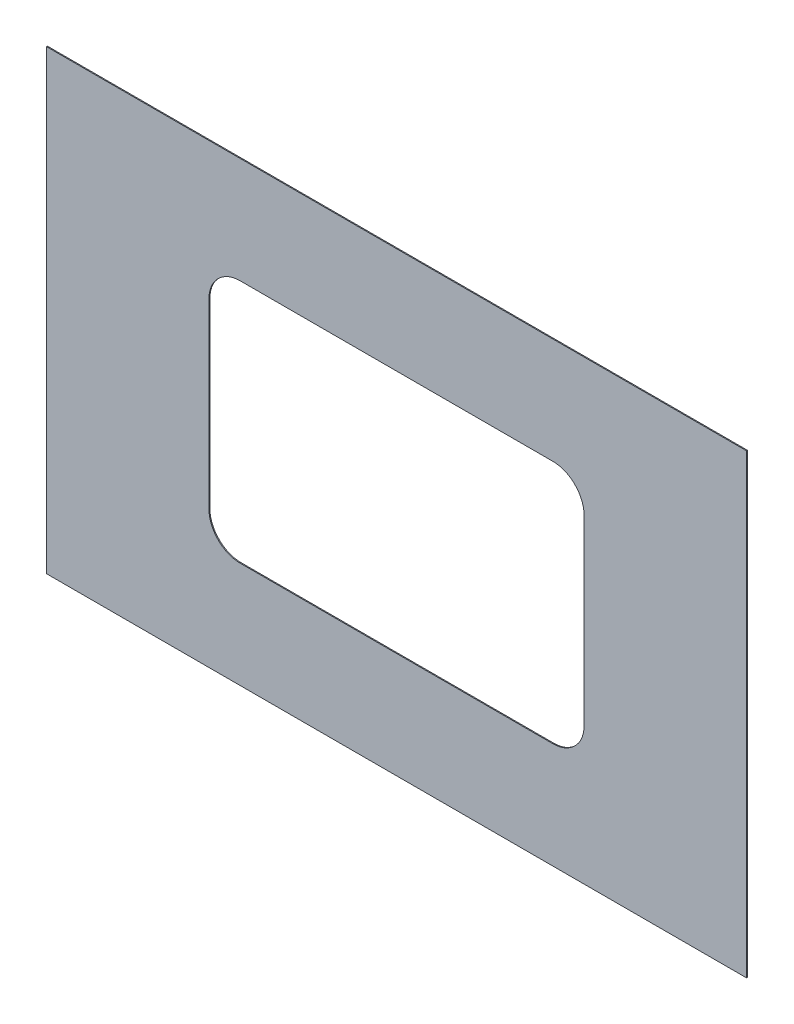
ISO-10303-21;
HEADER;
FILE_DESCRIPTION(('STEP AP214'),'2;1');
FILE_NAME('part.step','',(''),(''),'','','');
FILE_SCHEMA(('AUTOMOTIVE_DESIGN { 1 0 10303 214 1 1 1 1 }'));
ENDSEC;
DATA;
#1=APPLICATION_CONTEXT('core data for automotive mechanical design processes');
#2=APPLICATION_PROTOCOL_DEFINITION('international standard','automotive_design',2000,#1);
#3=PRODUCT_CONTEXT('',#1,'mechanical');
#4=PRODUCT('Part','Part','',(#3));
#5=PRODUCT_RELATED_PRODUCT_CATEGORY('part','',(#4));
#6=PRODUCT_DEFINITION_FORMATION('','',#4);
#7=PRODUCT_DEFINITION_CONTEXT('part definition',#1,'design');
#8=PRODUCT_DEFINITION('design','',#6,#7);
#9=PRODUCT_DEFINITION_SHAPE('','',#8);
#10=(LENGTH_UNIT() NAMED_UNIT(*) SI_UNIT(.MILLI.,.METRE.));
#11=(NAMED_UNIT(*) PLANE_ANGLE_UNIT() SI_UNIT($,.RADIAN.));
#12=(NAMED_UNIT(*) SI_UNIT($,.STERADIAN.) SOLID_ANGLE_UNIT());
#13=UNCERTAINTY_MEASURE_WITH_UNIT(LENGTH_MEASURE(1.E-05),#10,'distance_accuracy_value','');
#14=(GEOMETRIC_REPRESENTATION_CONTEXT(3) GLOBAL_UNCERTAINTY_ASSIGNED_CONTEXT((#13)) GLOBAL_UNIT_ASSIGNED_CONTEXT((#10,
#11,#12)) REPRESENTATION_CONTEXT('',''));
#15=CARTESIAN_POINT('',(0.,0.,0.));
#16=DIRECTION('',(0.,0.,1.));
#17=DIRECTION('',(1.,0.,0.));
#18=AXIS2_PLACEMENT_3D('',#15,#16,#17);
#19=CARTESIAN_POINT('',(0.,0.,1.5));
#20=DIRECTION('',(0.,0.,-1.));
#21=DIRECTION('',(-1.,0.,0.));
#22=AXIS2_PLACEMENT_3D('',#19,#20,#21);
#23=PLANE('',#22);
#24=DIRECTION('',(0.,-1.,0.));
#25=VECTOR('',#24,1.);
#26=CARTESIAN_POINT('',(-560.,365.,1.5));
#27=LINE('',#26,#25);
#28=CARTESIAN_POINT('',(-560.,365.,1.5));
#29=VERTEX_POINT('',#28);
#30=CARTESIAN_POINT('',(-560.,-365.,1.5));
#31=VERTEX_POINT('',#30);
#32=EDGE_CURVE('E218',#29,#31,#27,.T.);
#33=ORIENTED_EDGE('',*,*,#32,.T.);
#34=DIRECTION('',(1.,0.,0.));
#35=VECTOR('',#34,1.);
#36=CARTESIAN_POINT('',(560.,-365.,1.5));
#37=LINE('',#36,#35);
#38=CARTESIAN_POINT('',(560.,-365.,1.5));
#39=VERTEX_POINT('',#38);
#40=EDGE_CURVE('E222',#31,#39,#37,.T.);
#41=ORIENTED_EDGE('',*,*,#40,.T.);
#42=DIRECTION('',(0.,1.,0.));
#43=VECTOR('',#42,1.);
#44=CARTESIAN_POINT('',(560.,365.,1.5));
#45=LINE('',#44,#43);
#46=CARTESIAN_POINT('',(560.,365.,1.5));
#47=VERTEX_POINT('',#46);
#48=EDGE_CURVE('E226',#39,#47,#45,.T.);
#49=ORIENTED_EDGE('',*,*,#48,.T.);
#50=DIRECTION('',(-1.,0.,0.));
#51=VECTOR('',#50,1.);
#52=CARTESIAN_POINT('',(560.,365.,1.5));
#53=LINE('',#52,#51);
#54=EDGE_CURVE('E229',#47,#29,#53,.T.);
#55=ORIENTED_EDGE('',*,*,#54,.T.);
#56=EDGE_LOOP('',(#33,#41,#49,#55));
#57=FACE_BOUND('',#56,.T.);
#58=CARTESIAN_POINT('',(-250.,-145.535714285714,1.5));
#59=DIRECTION('',(0.,0.,1.));
#60=DIRECTION('',(-1.,0.,0.));
#61=AXIS2_PLACEMENT_3D('',#58,#59,#60);
#62=CIRCLE('',#61,50.);
#63=CARTESIAN_POINT('',(-300.,-145.535714285714,1.5));
#64=VERTEX_POINT('',#63);
#65=CARTESIAN_POINT('',(-250.,-195.535714285714,1.5));
#66=VERTEX_POINT('',#65);
#67=EDGE_CURVE('E129',#64,#66,#62,.T.);
#68=ORIENTED_EDGE('',*,*,#67,.F.);
#69=DIRECTION('',(0.,-1.,0.));
#70=VECTOR('',#69,1.);
#71=CARTESIAN_POINT('',(-300.,145.535714285714,1.5));
#72=LINE('',#71,#70);
#73=CARTESIAN_POINT('',(-300.,145.535714285714,1.5));
#74=VERTEX_POINT('',#73);
#75=EDGE_CURVE('E170',#74,#64,#72,.T.);
#76=ORIENTED_EDGE('',*,*,#75,.F.);
#77=CARTESIAN_POINT('',(-250.,145.535714285714,1.5));
#78=DIRECTION('',(0.,0.,1.));
#79=DIRECTION('',(1.,0.,0.));
#80=AXIS2_PLACEMENT_3D('',#77,#78,#79);
#81=CIRCLE('',#80,50.);
#82=CARTESIAN_POINT('',(-250.,195.535714285714,1.5));
#83=VERTEX_POINT('',#82);
#84=EDGE_CURVE('E167',#83,#74,#81,.T.);
#85=ORIENTED_EDGE('',*,*,#84,.F.);
#86=DIRECTION('',(-1.,0.,0.));
#87=VECTOR('',#86,1.);
#88=CARTESIAN_POINT('',(250.,195.535714285714,1.5));
#89=LINE('',#88,#87);
#90=CARTESIAN_POINT('',(250.,195.535714285714,1.5));
#91=VERTEX_POINT('',#90);
#92=EDGE_CURVE('E164',#91,#83,#89,.T.);
#93=ORIENTED_EDGE('',*,*,#92,.F.);
#94=CARTESIAN_POINT('',(250.,145.535714285714,1.5));
#95=DIRECTION('',(0.,0.,1.));
#96=DIRECTION('',(1.,0.,0.));
#97=AXIS2_PLACEMENT_3D('',#94,#95,#96);
#98=CIRCLE('',#97,50.);
#99=CARTESIAN_POINT('',(300.,145.535714285714,1.5));
#100=VERTEX_POINT('',#99);
#101=EDGE_CURVE('E161',#100,#91,#98,.T.);
#102=ORIENTED_EDGE('',*,*,#101,.F.);
#103=DIRECTION('',(0.,1.,0.));
#104=VECTOR('',#103,1.);
#105=CARTESIAN_POINT('',(300.,145.535714285714,1.5));
#106=LINE('',#105,#104);
#107=CARTESIAN_POINT('',(300.,-145.535714285714,1.5));
#108=VERTEX_POINT('',#107);
#109=EDGE_CURVE('E156',#108,#100,#106,.T.);
#110=ORIENTED_EDGE('',*,*,#109,.F.);
#111=CARTESIAN_POINT('',(250.,-145.535714285714,1.5));
#112=DIRECTION('',(0.,0.,1.));
#113=DIRECTION('',(-1.,0.,0.));
#114=AXIS2_PLACEMENT_3D('',#111,#112,#113);
#115=CIRCLE('',#114,50.);
#116=CARTESIAN_POINT('',(250.,-195.535714285714,1.5));
#117=VERTEX_POINT('',#116);
#118=EDGE_CURVE('E152',#117,#108,#115,.T.);
#119=ORIENTED_EDGE('',*,*,#118,.F.);
#120=DIRECTION('',(1.,0.,0.));
#121=VECTOR('',#120,1.);
#122=CARTESIAN_POINT('',(250.,-195.535714285714,1.5));
#123=LINE('',#122,#121);
#124=EDGE_CURVE('E138',#66,#117,#123,.T.);
#125=ORIENTED_EDGE('',*,*,#124,.F.);
#126=EDGE_LOOP('',(#68,#76,#85,#93,#102,#110,#119,#125));
#127=FACE_BOUND('',#126,.T.);
#128=ADVANCED_FACE('F39',(#57,#127),#23,.F.);
#129=CARTESIAN_POINT('',(0.,0.,0.));
#130=DIRECTION('',(0.,0.,-1.));
#131=DIRECTION('',(-1.,0.,0.));
#132=AXIS2_PLACEMENT_3D('',#129,#130,#131);
#133=PLANE('',#132);
#134=DIRECTION('',(0.,-1.,0.));
#135=VECTOR('',#134,1.);
#136=CARTESIAN_POINT('',(-560.,365.,0.));
#137=LINE('',#136,#135);
#138=CARTESIAN_POINT('',(-560.,365.,0.));
#139=VERTEX_POINT('',#138);
#140=CARTESIAN_POINT('',(-560.,-365.,0.));
#141=VERTEX_POINT('',#140);
#142=EDGE_CURVE('E147',#139,#141,#137,.T.);
#143=ORIENTED_EDGE('',*,*,#142,.F.);
#144=DIRECTION('',(-1.,0.,0.));
#145=VECTOR('',#144,1.);
#146=CARTESIAN_POINT('',(560.,365.,0.));
#147=LINE('',#146,#145);
#148=CARTESIAN_POINT('',(560.,365.,0.));
#149=VERTEX_POINT('',#148);
#150=EDGE_CURVE('E223',#149,#139,#147,.T.);
#151=ORIENTED_EDGE('',*,*,#150,.F.);
#152=DIRECTION('',(0.,1.,0.));
#153=VECTOR('',#152,1.);
#154=CARTESIAN_POINT('',(560.,365.,0.));
#155=LINE('',#154,#153);
#156=CARTESIAN_POINT('',(560.,-365.,0.));
#157=VERTEX_POINT('',#156);
#158=EDGE_CURVE('E239',#157,#149,#155,.T.);
#159=ORIENTED_EDGE('',*,*,#158,.F.);
#160=DIRECTION('',(1.,0.,0.));
#161=VECTOR('',#160,1.);
#162=CARTESIAN_POINT('',(560.,-365.,0.));
#163=LINE('',#162,#161);
#164=EDGE_CURVE('E236',#141,#157,#163,.T.);
#165=ORIENTED_EDGE('',*,*,#164,.F.);
#166=EDGE_LOOP('',(#143,#151,#159,#165));
#167=FACE_BOUND('',#166,.T.);
#168=DIRECTION('',(0.,-1.,0.));
#169=VECTOR('',#168,1.);
#170=CARTESIAN_POINT('',(-300.,145.535714285714,0.));
#171=LINE('',#170,#169);
#172=CARTESIAN_POINT('',(-300.,145.535714285714,0.));
#173=VERTEX_POINT('',#172);
#174=CARTESIAN_POINT('',(-300.,-145.535714285714,0.));
#175=VERTEX_POINT('',#174);
#176=EDGE_CURVE('E139',#173,#175,#171,.T.);
#177=ORIENTED_EDGE('',*,*,#176,.T.);
#178=CARTESIAN_POINT('',(-250.,-145.535714285714,0.));
#179=DIRECTION('',(0.,0.,1.));
#180=DIRECTION('',(-1.,0.,0.));
#181=AXIS2_PLACEMENT_3D('',#178,#179,#180);
#182=CIRCLE('',#181,50.);
#183=CARTESIAN_POINT('',(-250.,-195.535714285714,0.));
#184=VERTEX_POINT('',#183);
#185=EDGE_CURVE('E63',#175,#184,#182,.T.);
#186=ORIENTED_EDGE('',*,*,#185,.T.);
#187=DIRECTION('',(1.,0.,0.));
#188=VECTOR('',#187,1.);
#189=CARTESIAN_POINT('',(250.,-195.535714285714,0.));
#190=LINE('',#189,#188);
#191=CARTESIAN_POINT('',(250.,-195.535714285714,0.));
#192=VERTEX_POINT('',#191);
#193=EDGE_CURVE('E145',#184,#192,#190,.T.);
#194=ORIENTED_EDGE('',*,*,#193,.T.);
#195=CARTESIAN_POINT('',(250.,-145.535714285714,0.));
#196=DIRECTION('',(0.,0.,1.));
#197=DIRECTION('',(-1.,0.,0.));
#198=AXIS2_PLACEMENT_3D('',#195,#196,#197);
#199=CIRCLE('',#198,50.);
#200=CARTESIAN_POINT('',(300.,-145.535714285714,0.));
#201=VERTEX_POINT('',#200);
#202=EDGE_CURVE('E177',#192,#201,#199,.T.);
#203=ORIENTED_EDGE('',*,*,#202,.T.);
#204=DIRECTION('',(0.,1.,0.));
#205=VECTOR('',#204,1.);
#206=CARTESIAN_POINT('',(300.,145.535714285714,0.));
#207=LINE('',#206,#205);
#208=CARTESIAN_POINT('',(300.,145.535714285714,0.));
#209=VERTEX_POINT('',#208);
#210=EDGE_CURVE('E181',#201,#209,#207,.T.);
#211=ORIENTED_EDGE('',*,*,#210,.T.);
#212=CARTESIAN_POINT('',(250.,145.535714285714,0.));
#213=DIRECTION('',(0.,0.,1.));
#214=DIRECTION('',(1.,0.,0.));
#215=AXIS2_PLACEMENT_3D('',#212,#213,#214);
#216=CIRCLE('',#215,50.);
#217=CARTESIAN_POINT('',(250.,195.535714285714,0.));
#218=VERTEX_POINT('',#217);
#219=EDGE_CURVE('E185',#209,#218,#216,.T.);
#220=ORIENTED_EDGE('',*,*,#219,.T.);
#221=DIRECTION('',(-1.,0.,0.));
#222=VECTOR('',#221,1.);
#223=CARTESIAN_POINT('',(250.,195.535714285714,0.));
#224=LINE('',#223,#222);
#225=CARTESIAN_POINT('',(-250.,195.535714285714,0.));
#226=VERTEX_POINT('',#225);
#227=EDGE_CURVE('E189',#218,#226,#224,.T.);
#228=ORIENTED_EDGE('',*,*,#227,.T.);
#229=CARTESIAN_POINT('',(-250.,145.535714285714,0.));
#230=DIRECTION('',(0.,0.,1.));
#231=DIRECTION('',(1.,0.,0.));
#232=AXIS2_PLACEMENT_3D('',#229,#230,#231);
#233=CIRCLE('',#232,50.);
#234=EDGE_CURVE('E193',#226,#173,#233,.T.);
#235=ORIENTED_EDGE('',*,*,#234,.T.);
#236=EDGE_LOOP('',(#177,#186,#194,#203,#211,#220,#228,#235));
#237=FACE_BOUND('',#236,.T.);
#238=ADVANCED_FACE('F262',(#167,#237),#133,.T.);
#239=CARTESIAN_POINT('',(-560.,365.,1.5));
#240=DIRECTION('',(1.,0.,0.));
#241=DIRECTION('',(0.,1.,0.));
#242=AXIS2_PLACEMENT_3D('',#239,#240,#241);
#243=PLANE('',#242);
#244=ORIENTED_EDGE('',*,*,#142,.T.);
#245=DIRECTION('',(0.,0.,-1.));
#246=VECTOR('',#245,1.);
#247=CARTESIAN_POINT('',(-560.,-365.,1.5));
#248=LINE('',#247,#246);
#249=EDGE_CURVE('E11',#31,#141,#248,.T.);
#250=ORIENTED_EDGE('',*,*,#249,.F.);
#251=ORIENTED_EDGE('',*,*,#32,.F.);
#252=DIRECTION('',(0.,0.,-1.));
#253=VECTOR('',#252,1.);
#254=CARTESIAN_POINT('',(-560.,365.,1.5));
#255=LINE('',#254,#253);
#256=EDGE_CURVE('E232',#29,#139,#255,.T.);
#257=ORIENTED_EDGE('',*,*,#256,.T.);
#258=EDGE_LOOP('',(#244,#250,#251,#257));
#259=FACE_BOUND('',#258,.T.);
#260=ADVANCED_FACE('F41',(#259),#243,.F.);
#261=CARTESIAN_POINT('',(560.,-365.,1.5));
#262=DIRECTION('',(0.,1.,0.));
#263=DIRECTION('',(-1.,0.,0.));
#264=AXIS2_PLACEMENT_3D('',#261,#262,#263);
#265=PLANE('',#264);
#266=ORIENTED_EDGE('',*,*,#164,.T.);
#267=DIRECTION('',(0.,0.,-1.));
#268=VECTOR('',#267,1.);
#269=CARTESIAN_POINT('',(560.,-365.,1.5));
#270=LINE('',#269,#268);
#271=EDGE_CURVE('E48',#39,#157,#270,.T.);
#272=ORIENTED_EDGE('',*,*,#271,.F.);
#273=ORIENTED_EDGE('',*,*,#40,.F.);
#274=ORIENTED_EDGE('',*,*,#249,.T.);
#275=EDGE_LOOP('',(#266,#272,#273,#274));
#276=FACE_BOUND('',#275,.T.);
#277=ADVANCED_FACE('F272',(#276),#265,.F.);
#278=CARTESIAN_POINT('',(560.,365.,1.5));
#279=DIRECTION('',(-1.,0.,0.));
#280=DIRECTION('',(0.,-1.,0.));
#281=AXIS2_PLACEMENT_3D('',#278,#279,#280);
#282=PLANE('',#281);
#283=ORIENTED_EDGE('',*,*,#158,.T.);
#284=DIRECTION('',(0.,0.,-1.));
#285=VECTOR('',#284,1.);
#286=CARTESIAN_POINT('',(560.,365.,1.5));
#287=LINE('',#286,#285);
#288=EDGE_CURVE('E247',#47,#149,#287,.T.);
#289=ORIENTED_EDGE('',*,*,#288,.F.);
#290=ORIENTED_EDGE('',*,*,#48,.F.);
#291=ORIENTED_EDGE('',*,*,#271,.T.);
#292=EDGE_LOOP('',(#283,#289,#290,#291));
#293=FACE_BOUND('',#292,.T.);
#294=ADVANCED_FACE('F256',(#293),#282,.F.);
#295=CARTESIAN_POINT('',(560.,365.,1.5));
#296=DIRECTION('',(0.,-1.,0.));
#297=DIRECTION('',(1.,0.,0.));
#298=AXIS2_PLACEMENT_3D('',#295,#296,#297);
#299=PLANE('',#298);
#300=ORIENTED_EDGE('',*,*,#150,.T.);
#301=ORIENTED_EDGE('',*,*,#256,.F.);
#302=ORIENTED_EDGE('',*,*,#54,.F.);
#303=ORIENTED_EDGE('',*,*,#288,.T.);
#304=EDGE_LOOP('',(#300,#301,#302,#303));
#305=FACE_BOUND('',#304,.T.);
#306=ADVANCED_FACE('F266',(#305),#299,.F.);
#307=CARTESIAN_POINT('',(-250.,-145.535714285714,1.5));
#308=DIRECTION('',(0.,0.,-1.));
#309=DIRECTION('',(-1.,0.,0.));
#310=AXIS2_PLACEMENT_3D('',#307,#308,#309);
#311=CYLINDRICAL_SURFACE('',#310,50.);
#312=ORIENTED_EDGE('',*,*,#185,.F.);
#313=DIRECTION('',(0.,0.,-1.));
#314=VECTOR('',#313,1.);
#315=CARTESIAN_POINT('',(-300.,-145.535714285714,1.5));
#316=LINE('',#315,#314);
#317=EDGE_CURVE('E133',#64,#175,#316,.T.);
#318=ORIENTED_EDGE('',*,*,#317,.F.);
#319=ORIENTED_EDGE('',*,*,#67,.T.);
#320=DIRECTION('',(0.,0.,-1.));
#321=VECTOR('',#320,1.);
#322=CARTESIAN_POINT('',(-250.,-195.535714285714,1.5));
#323=LINE('',#322,#321);
#324=EDGE_CURVE('E132',#66,#184,#323,.T.);
#325=ORIENTED_EDGE('',*,*,#324,.T.);
#326=EDGE_LOOP('',(#312,#318,#319,#325));
#327=FACE_BOUND('',#326,.T.);
#328=ADVANCED_FACE('F131',(#327),#311,.F.);
#329=CARTESIAN_POINT('',(250.,-195.535714285714,1.5));
#330=DIRECTION('',(0.,1.,0.));
#331=DIRECTION('',(0.,0.,1.));
#332=AXIS2_PLACEMENT_3D('',#329,#330,#331);
#333=PLANE('',#332);
#334=ORIENTED_EDGE('',*,*,#193,.F.);
#335=ORIENTED_EDGE('',*,*,#324,.F.);
#336=ORIENTED_EDGE('',*,*,#124,.T.);
#337=DIRECTION('',(0.,0.,-1.));
#338=VECTOR('',#337,1.);
#339=CARTESIAN_POINT('',(250.,-195.535714285714,1.5));
#340=LINE('',#339,#338);
#341=EDGE_CURVE('E148',#117,#192,#340,.T.);
#342=ORIENTED_EDGE('',*,*,#341,.T.);
#343=EDGE_LOOP('',(#334,#335,#336,#342));
#344=FACE_BOUND('',#343,.T.);
#345=ADVANCED_FACE('F142',(#344),#333,.T.);
#346=CARTESIAN_POINT('',(250.,-145.535714285714,1.5));
#347=DIRECTION('',(0.,0.,-1.));
#348=DIRECTION('',(-1.,0.,0.));
#349=AXIS2_PLACEMENT_3D('',#346,#347,#348);
#350=CYLINDRICAL_SURFACE('',#349,50.);
#351=ORIENTED_EDGE('',*,*,#202,.F.);
#352=ORIENTED_EDGE('',*,*,#341,.F.);
#353=ORIENTED_EDGE('',*,*,#118,.T.);
#354=DIRECTION('',(0.,0.,-1.));
#355=VECTOR('',#354,1.);
#356=CARTESIAN_POINT('',(300.,-145.535714285714,1.5));
#357=LINE('',#356,#355);
#358=EDGE_CURVE('E213',#108,#201,#357,.T.);
#359=ORIENTED_EDGE('',*,*,#358,.T.);
#360=EDGE_LOOP('',(#351,#352,#353,#359));
#361=FACE_BOUND('',#360,.T.);
#362=ADVANCED_FACE('F295',(#361),#350,.F.);
#363=CARTESIAN_POINT('',(300.,145.535714285714,1.5));
#364=DIRECTION('',(-1.,0.,0.));
#365=DIRECTION('',(0.,0.,1.));
#366=AXIS2_PLACEMENT_3D('',#363,#364,#365);
#367=PLANE('',#366);
#368=ORIENTED_EDGE('',*,*,#210,.F.);
#369=ORIENTED_EDGE('',*,*,#358,.F.);
#370=ORIENTED_EDGE('',*,*,#109,.T.);
#371=DIRECTION('',(0.,0.,-1.));
#372=VECTOR('',#371,1.);
#373=CARTESIAN_POINT('',(300.,145.535714285714,1.5));
#374=LINE('',#373,#372);
#375=EDGE_CURVE('E210',#100,#209,#374,.T.);
#376=ORIENTED_EDGE('',*,*,#375,.T.);
#377=EDGE_LOOP('',(#368,#369,#370,#376));
#378=FACE_BOUND('',#377,.T.);
#379=ADVANCED_FACE('F299',(#378),#367,.T.);
#380=CARTESIAN_POINT('',(250.,145.535714285714,1.5));
#381=DIRECTION('',(0.,0.,-1.));
#382=DIRECTION('',(-1.,0.,0.));
#383=AXIS2_PLACEMENT_3D('',#380,#381,#382);
#384=CYLINDRICAL_SURFACE('',#383,50.);
#385=ORIENTED_EDGE('',*,*,#219,.F.);
#386=ORIENTED_EDGE('',*,*,#375,.F.);
#387=ORIENTED_EDGE('',*,*,#101,.T.);
#388=DIRECTION('',(0.,0.,-1.));
#389=VECTOR('',#388,1.);
#390=CARTESIAN_POINT('',(250.,195.535714285714,1.5));
#391=LINE('',#390,#389);
#392=EDGE_CURVE('E207',#91,#218,#391,.T.);
#393=ORIENTED_EDGE('',*,*,#392,.T.);
#394=EDGE_LOOP('',(#385,#386,#387,#393));
#395=FACE_BOUND('',#394,.T.);
#396=ADVANCED_FACE('F305',(#395),#384,.F.);
#397=CARTESIAN_POINT('',(250.,195.535714285714,1.5));
#398=DIRECTION('',(0.,-1.,0.));
#399=DIRECTION('',(0.,0.,-1.));
#400=AXIS2_PLACEMENT_3D('',#397,#398,#399);
#401=PLANE('',#400);
#402=ORIENTED_EDGE('',*,*,#227,.F.);
#403=ORIENTED_EDGE('',*,*,#392,.F.);
#404=ORIENTED_EDGE('',*,*,#92,.T.);
#405=DIRECTION('',(0.,0.,-1.));
#406=VECTOR('',#405,1.);
#407=CARTESIAN_POINT('',(-250.,195.535714285714,1.5));
#408=LINE('',#407,#406);
#409=EDGE_CURVE('E204',#83,#226,#408,.T.);
#410=ORIENTED_EDGE('',*,*,#409,.T.);
#411=EDGE_LOOP('',(#402,#403,#404,#410));
#412=FACE_BOUND('',#411,.T.);
#413=ADVANCED_FACE('F309',(#412),#401,.T.);
#414=CARTESIAN_POINT('',(-250.,145.535714285714,1.5));
#415=DIRECTION('',(0.,0.,-1.));
#416=DIRECTION('',(-1.,0.,0.));
#417=AXIS2_PLACEMENT_3D('',#414,#415,#416);
#418=CYLINDRICAL_SURFACE('',#417,50.);
#419=ORIENTED_EDGE('',*,*,#234,.F.);
#420=ORIENTED_EDGE('',*,*,#409,.F.);
#421=ORIENTED_EDGE('',*,*,#84,.T.);
#422=DIRECTION('',(0.,0.,-1.));
#423=VECTOR('',#422,1.);
#424=CARTESIAN_POINT('',(-300.,145.535714285714,1.5));
#425=LINE('',#424,#423);
#426=EDGE_CURVE('E55',#74,#173,#425,.T.);
#427=ORIENTED_EDGE('',*,*,#426,.T.);
#428=EDGE_LOOP('',(#419,#420,#421,#427));
#429=FACE_BOUND('',#428,.T.);
#430=ADVANCED_FACE('F313',(#429),#418,.F.);
#431=CARTESIAN_POINT('',(-300.,145.535714285714,1.5));
#432=DIRECTION('',(1.,0.,0.));
#433=DIRECTION('',(0.,0.,-1.));
#434=AXIS2_PLACEMENT_3D('',#431,#432,#433);
#435=PLANE('',#434);
#436=ORIENTED_EDGE('',*,*,#176,.F.);
#437=ORIENTED_EDGE('',*,*,#426,.F.);
#438=ORIENTED_EDGE('',*,*,#75,.T.);
#439=ORIENTED_EDGE('',*,*,#317,.T.);
#440=EDGE_LOOP('',(#436,#437,#438,#439));
#441=FACE_BOUND('',#440,.T.);
#442=ADVANCED_FACE('F317',(#441),#435,.T.);
#443=CLOSED_SHELL('',(#128,#238,#260,#277,#294,#306,#328,#345,#362,#379,#396,#413,#430,#442));
#444=MANIFOLD_SOLID_BREP('B2',#443);
#445=ADVANCED_BREP_SHAPE_REPRESENTATION('',(#18,#444),#14);
#446=SHAPE_DEFINITION_REPRESENTATION(#9,#445);
ENDSEC;
END-ISO-10303-21;
